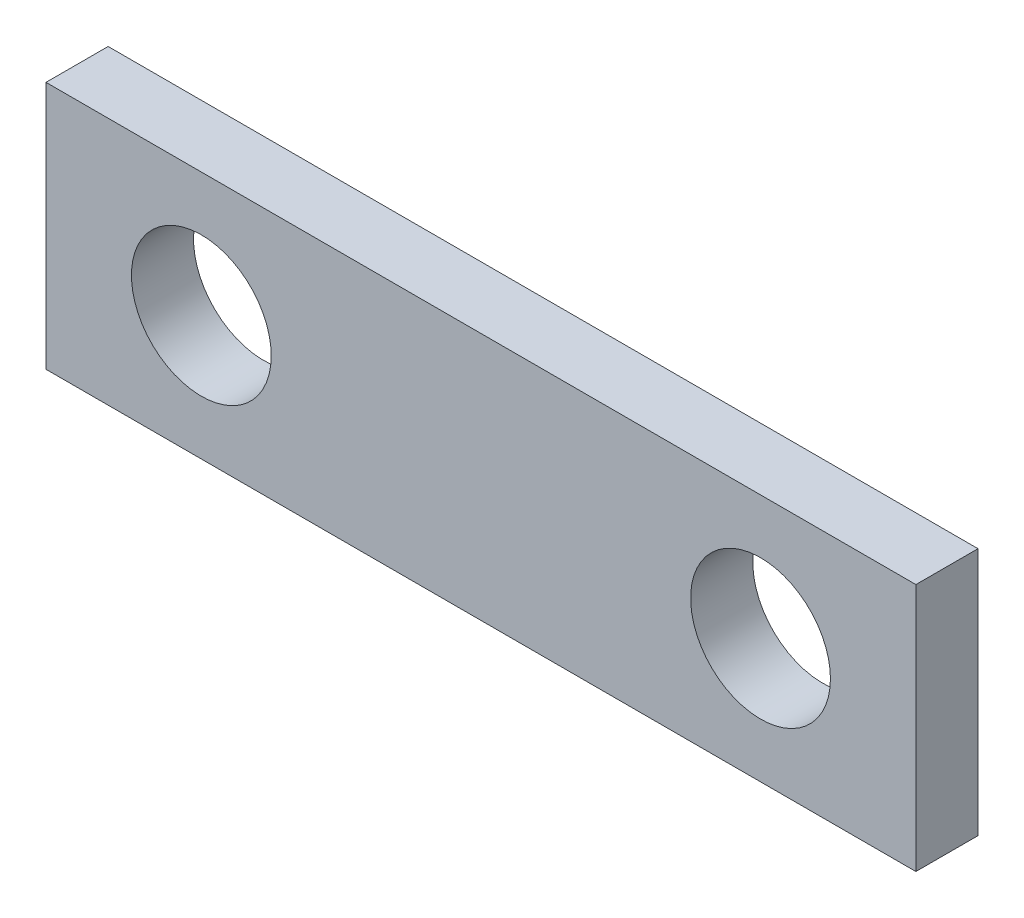
ISO-10303-21;
HEADER;
FILE_DESCRIPTION(('STEP AP214'),'2;1');
FILE_NAME('part.step','',(''),(''),'','','');
FILE_SCHEMA(('AUTOMOTIVE_DESIGN { 1 0 10303 214 1 1 1 1 }'));
ENDSEC;
DATA;
#1=APPLICATION_CONTEXT('core data for automotive mechanical design processes');
#2=APPLICATION_PROTOCOL_DEFINITION('international standard','automotive_design',2000,#1);
#3=PRODUCT_CONTEXT('',#1,'mechanical');
#4=PRODUCT('Part','Part','',(#3));
#5=PRODUCT_RELATED_PRODUCT_CATEGORY('part','',(#4));
#6=PRODUCT_DEFINITION_FORMATION('','',#4);
#7=PRODUCT_DEFINITION_CONTEXT('part definition',#1,'design');
#8=PRODUCT_DEFINITION('design','',#6,#7);
#9=PRODUCT_DEFINITION_SHAPE('','',#8);
#10=(LENGTH_UNIT() NAMED_UNIT(*) SI_UNIT(.MILLI.,.METRE.));
#11=(NAMED_UNIT(*) PLANE_ANGLE_UNIT() SI_UNIT($,.RADIAN.));
#12=(NAMED_UNIT(*) SI_UNIT($,.STERADIAN.) SOLID_ANGLE_UNIT());
#13=UNCERTAINTY_MEASURE_WITH_UNIT(LENGTH_MEASURE(1.E-05),#10,'distance_accuracy_value','');
#14=(GEOMETRIC_REPRESENTATION_CONTEXT(3) GLOBAL_UNCERTAINTY_ASSIGNED_CONTEXT((#13)) GLOBAL_UNIT_ASSIGNED_CONTEXT((#10,
#11,#12)) REPRESENTATION_CONTEXT('',''));
#15=CARTESIAN_POINT('',(0.,0.,0.));
#16=DIRECTION('',(0.,0.,1.));
#17=DIRECTION('',(1.,0.,0.));
#18=AXIS2_PLACEMENT_3D('',#15,#16,#17);
#19=CARTESIAN_POINT('',(9.,0.,-1.));
#20=DIRECTION('',(0.,0.,1.));
#21=DIRECTION('',(1.,0.,0.));
#22=AXIS2_PLACEMENT_3D('',#19,#20,#21);
#23=CYLINDRICAL_SURFACE('',#22,2.25);
#24=CARTESIAN_POINT('',(9.,0.,2.));
#25=DIRECTION('',(0.,0.,1.));
#26=DIRECTION('',(1.,0.,0.));
#27=AXIS2_PLACEMENT_3D('',#24,#25,#26);
#28=CIRCLE('',#27,2.25);
#29=CARTESIAN_POINT('',(11.25,0.,2.));
#30=VERTEX_POINT('',#29);
#31=EDGE_CURVE('E113',#30,#30,#28,.T.);
#32=ORIENTED_EDGE('',*,*,#31,.T.);
#33=EDGE_LOOP('',(#32));
#34=FACE_BOUND('',#33,.T.);
#35=CARTESIAN_POINT('',(9.,0.,0.));
#36=DIRECTION('',(0.,0.,1.));
#37=DIRECTION('',(1.,0.,0.));
#38=AXIS2_PLACEMENT_3D('',#35,#36,#37);
#39=CIRCLE('',#38,2.25);
#40=CARTESIAN_POINT('',(11.25,0.,0.));
#41=VERTEX_POINT('',#40);
#42=EDGE_CURVE('E10',#41,#41,#39,.T.);
#43=ORIENTED_EDGE('',*,*,#42,.F.);
#44=EDGE_LOOP('',(#43));
#45=FACE_BOUND('',#44,.T.);
#46=ADVANCED_FACE('F16',(#34,#45),#23,.F.);
#47=CARTESIAN_POINT('',(-9.,0.,-1.));
#48=DIRECTION('',(0.,0.,1.));
#49=DIRECTION('',(1.,0.,0.));
#50=AXIS2_PLACEMENT_3D('',#47,#48,#49);
#51=CYLINDRICAL_SURFACE('',#50,2.25);
#52=CARTESIAN_POINT('',(-9.,0.,2.));
#53=DIRECTION('',(0.,0.,1.));
#54=DIRECTION('',(1.,0.,0.));
#55=AXIS2_PLACEMENT_3D('',#52,#53,#54);
#56=CIRCLE('',#55,2.25);
#57=CARTESIAN_POINT('',(-6.75,0.,2.));
#58=VERTEX_POINT('',#57);
#59=EDGE_CURVE('E112',#58,#58,#56,.T.);
#60=ORIENTED_EDGE('',*,*,#59,.T.);
#61=EDGE_LOOP('',(#60));
#62=FACE_BOUND('',#61,.T.);
#63=CARTESIAN_POINT('',(-9.,0.,0.));
#64=DIRECTION('',(0.,0.,1.));
#65=DIRECTION('',(1.,0.,0.));
#66=AXIS2_PLACEMENT_3D('',#63,#64,#65);
#67=CIRCLE('',#66,2.25);
#68=CARTESIAN_POINT('',(-6.75,0.,0.));
#69=VERTEX_POINT('',#68);
#70=EDGE_CURVE('E19',#69,#69,#67,.T.);
#71=ORIENTED_EDGE('',*,*,#70,.F.);
#72=EDGE_LOOP('',(#71));
#73=FACE_BOUND('',#72,.T.);
#74=ADVANCED_FACE('F138',(#62,#73),#51,.F.);
#75=CARTESIAN_POINT('',(14.,-4.,0.));
#76=DIRECTION('',(1.,0.,0.));
#77=DIRECTION('',(0.,1.,0.));
#78=AXIS2_PLACEMENT_3D('',#75,#76,#77);
#79=PLANE('',#78);
#80=DIRECTION('',(0.,0.,1.));
#81=VECTOR('',#80,1.);
#82=CARTESIAN_POINT('',(14.,-4.,0.));
#83=LINE('',#82,#81);
#84=CARTESIAN_POINT('',(14.,-4.,0.));
#85=VERTEX_POINT('',#84);
#86=CARTESIAN_POINT('',(14.,-4.,2.));
#87=VERTEX_POINT('',#86);
#88=EDGE_CURVE('E77',#85,#87,#83,.T.);
#89=ORIENTED_EDGE('',*,*,#88,.F.);
#90=DIRECTION('',(0.,1.,0.));
#91=VECTOR('',#90,1.);
#92=CARTESIAN_POINT('',(14.,-4.,0.));
#93=LINE('',#92,#91);
#94=CARTESIAN_POINT('',(14.,4.,0.));
#95=VERTEX_POINT('',#94);
#96=EDGE_CURVE('E37',#85,#95,#93,.T.);
#97=ORIENTED_EDGE('',*,*,#96,.T.);
#98=DIRECTION('',(0.,0.,1.));
#99=VECTOR('',#98,1.);
#100=CARTESIAN_POINT('',(14.,4.,0.));
#101=LINE('',#100,#99);
#102=CARTESIAN_POINT('',(14.,4.,2.));
#103=VERTEX_POINT('',#102);
#104=EDGE_CURVE('E43',#95,#103,#101,.T.);
#105=ORIENTED_EDGE('',*,*,#104,.T.);
#106=DIRECTION('',(0.,1.,0.));
#107=VECTOR('',#106,1.);
#108=CARTESIAN_POINT('',(14.,-4.,2.));
#109=LINE('',#108,#107);
#110=EDGE_CURVE('E104',#87,#103,#109,.T.);
#111=ORIENTED_EDGE('',*,*,#110,.F.);
#112=EDGE_LOOP('',(#89,#97,#105,#111));
#113=FACE_BOUND('',#112,.T.);
#114=ADVANCED_FACE('F140',(#113),#79,.T.);
#115=CARTESIAN_POINT('',(-14.,-4.,0.));
#116=DIRECTION('',(0.,0.,1.));
#117=DIRECTION('',(1.,0.,0.));
#118=AXIS2_PLACEMENT_3D('',#115,#116,#117);
#119=PLANE('',#118);
#120=ORIENTED_EDGE('',*,*,#42,.T.);
#121=EDGE_LOOP('',(#120));
#122=FACE_BOUND('',#121,.T.);
#123=ORIENTED_EDGE('',*,*,#70,.T.);
#124=EDGE_LOOP('',(#123));
#125=FACE_BOUND('',#124,.T.);
#126=DIRECTION('',(1.,0.,0.));
#127=VECTOR('',#126,1.);
#128=CARTESIAN_POINT('',(-14.,4.,0.));
#129=LINE('',#128,#127);
#130=CARTESIAN_POINT('',(-14.,4.,0.));
#131=VERTEX_POINT('',#130);
#132=EDGE_CURVE('E117',#131,#95,#129,.T.);
#133=ORIENTED_EDGE('',*,*,#132,.T.);
#134=ORIENTED_EDGE('',*,*,#96,.F.);
#135=DIRECTION('',(1.,0.,0.));
#136=VECTOR('',#135,1.);
#137=CARTESIAN_POINT('',(-14.,-4.,0.));
#138=LINE('',#137,#136);
#139=CARTESIAN_POINT('',(-14.,-4.,0.));
#140=VERTEX_POINT('',#139);
#141=EDGE_CURVE('E82',#140,#85,#138,.T.);
#142=ORIENTED_EDGE('',*,*,#141,.F.);
#143=DIRECTION('',(0.,1.,0.));
#144=VECTOR('',#143,1.);
#145=CARTESIAN_POINT('',(-14.,-4.,0.));
#146=LINE('',#145,#144);
#147=EDGE_CURVE('E90',#140,#131,#146,.T.);
#148=ORIENTED_EDGE('',*,*,#147,.T.);
#149=EDGE_LOOP('',(#133,#134,#142,#148));
#150=FACE_BOUND('',#149,.T.);
#151=ADVANCED_FACE('F135',(#122,#125,#150),#119,.F.);
#152=CARTESIAN_POINT('',(-14.,4.,0.));
#153=DIRECTION('',(0.,1.,0.));
#154=DIRECTION('',(1.,0.,0.));
#155=AXIS2_PLACEMENT_3D('',#152,#153,#154);
#156=PLANE('',#155);
#157=ORIENTED_EDGE('',*,*,#132,.F.);
#158=DIRECTION('',(0.,0.,1.));
#159=VECTOR('',#158,1.);
#160=CARTESIAN_POINT('',(-14.,4.,0.));
#161=LINE('',#160,#159);
#162=CARTESIAN_POINT('',(-14.,4.,2.));
#163=VERTEX_POINT('',#162);
#164=EDGE_CURVE('E97',#131,#163,#161,.T.);
#165=ORIENTED_EDGE('',*,*,#164,.T.);
#166=DIRECTION('',(1.,0.,0.));
#167=VECTOR('',#166,1.);
#168=CARTESIAN_POINT('',(-14.,4.,2.));
#169=LINE('',#168,#167);
#170=EDGE_CURVE('E94',#163,#103,#169,.T.);
#171=ORIENTED_EDGE('',*,*,#170,.T.);
#172=ORIENTED_EDGE('',*,*,#104,.F.);
#173=EDGE_LOOP('',(#157,#165,#171,#172));
#174=FACE_BOUND('',#173,.T.);
#175=ADVANCED_FACE('F152',(#174),#156,.T.);
#176=CARTESIAN_POINT('',(-14.,-4.,2.));
#177=DIRECTION('',(0.,0.,1.));
#178=DIRECTION('',(1.,0.,0.));
#179=AXIS2_PLACEMENT_3D('',#176,#177,#178);
#180=PLANE('',#179);
#181=ORIENTED_EDGE('',*,*,#31,.F.);
#182=EDGE_LOOP('',(#181));
#183=FACE_BOUND('',#182,.T.);
#184=ORIENTED_EDGE('',*,*,#59,.F.);
#185=EDGE_LOOP('',(#184));
#186=FACE_BOUND('',#185,.T.);
#187=DIRECTION('',(0.,1.,0.));
#188=VECTOR('',#187,1.);
#189=CARTESIAN_POINT('',(-14.,-4.,2.));
#190=LINE('',#189,#188);
#191=CARTESIAN_POINT('',(-14.,-4.,2.));
#192=VERTEX_POINT('',#191);
#193=EDGE_CURVE('E88',#192,#163,#190,.T.);
#194=ORIENTED_EDGE('',*,*,#193,.F.);
#195=DIRECTION('',(1.,0.,0.));
#196=VECTOR('',#195,1.);
#197=CARTESIAN_POINT('',(-14.,-4.,2.));
#198=LINE('',#197,#196);
#199=EDGE_CURVE('E71',#192,#87,#198,.T.);
#200=ORIENTED_EDGE('',*,*,#199,.T.);
#201=ORIENTED_EDGE('',*,*,#110,.T.);
#202=ORIENTED_EDGE('',*,*,#170,.F.);
#203=EDGE_LOOP('',(#194,#200,#201,#202));
#204=FACE_BOUND('',#203,.T.);
#205=ADVANCED_FACE('F93',(#183,#186,#204),#180,.T.);
#206=CARTESIAN_POINT('',(-14.,-4.,0.));
#207=DIRECTION('',(0.,1.,0.));
#208=DIRECTION('',(1.,0.,0.));
#209=AXIS2_PLACEMENT_3D('',#206,#207,#208);
#210=PLANE('',#209);
#211=ORIENTED_EDGE('',*,*,#88,.T.);
#212=ORIENTED_EDGE('',*,*,#199,.F.);
#213=DIRECTION('',(0.,0.,1.));
#214=VECTOR('',#213,1.);
#215=CARTESIAN_POINT('',(-14.,-4.,0.));
#216=LINE('',#215,#214);
#217=EDGE_CURVE('E75',#140,#192,#216,.T.);
#218=ORIENTED_EDGE('',*,*,#217,.F.);
#219=ORIENTED_EDGE('',*,*,#141,.T.);
#220=EDGE_LOOP('',(#211,#212,#218,#219));
#221=FACE_BOUND('',#220,.T.);
#222=ADVANCED_FACE('F73',(#221),#210,.F.);
#223=CARTESIAN_POINT('',(-14.,-4.,0.));
#224=DIRECTION('',(1.,0.,0.));
#225=DIRECTION('',(0.,1.,0.));
#226=AXIS2_PLACEMENT_3D('',#223,#224,#225);
#227=PLANE('',#226);
#228=ORIENTED_EDGE('',*,*,#193,.T.);
#229=ORIENTED_EDGE('',*,*,#164,.F.);
#230=ORIENTED_EDGE('',*,*,#147,.F.);
#231=ORIENTED_EDGE('',*,*,#217,.T.);
#232=EDGE_LOOP('',(#228,#229,#230,#231));
#233=FACE_BOUND('',#232,.T.);
#234=ADVANCED_FACE('F86',(#233),#227,.F.);
#235=CLOSED_SHELL('',(#46,#74,#114,#151,#175,#205,#222,#234));
#236=MANIFOLD_SOLID_BREP('B1',#235);
#237=ADVANCED_BREP_SHAPE_REPRESENTATION('',(#18,#236),#14);
#238=SHAPE_DEFINITION_REPRESENTATION(#9,#237);
ENDSEC;
END-ISO-10303-21;
